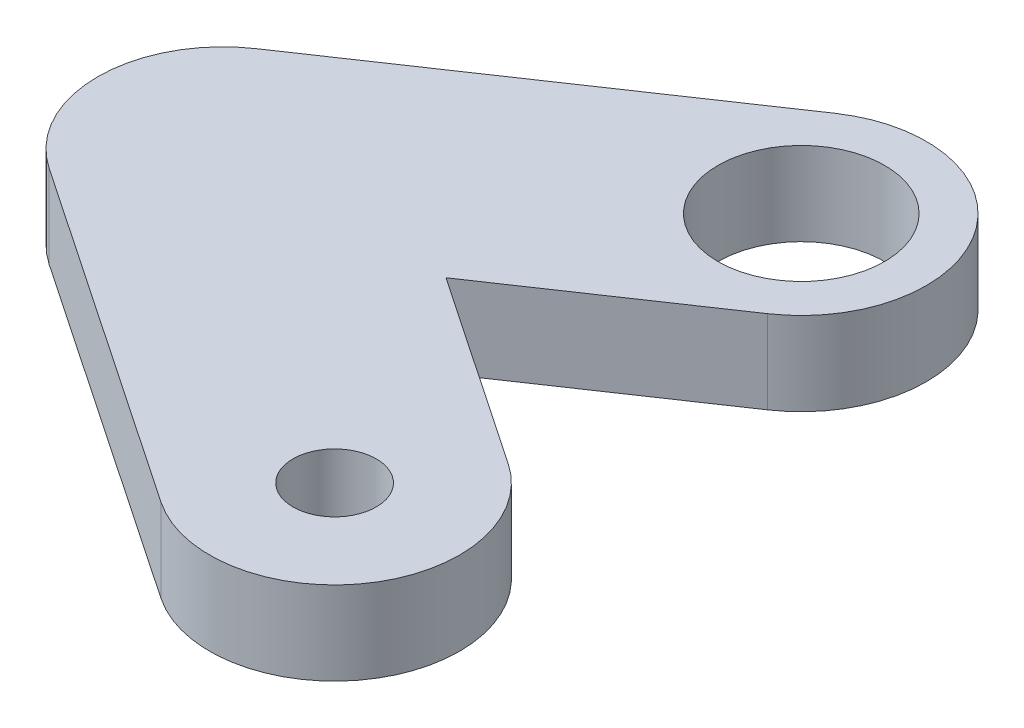
ISO-10303-21;
HEADER;
FILE_DESCRIPTION(('STEP AP214'),'2;1');
FILE_NAME('part.step','',(''),(''),'','','');
FILE_SCHEMA(('AUTOMOTIVE_DESIGN { 1 0 10303 214 1 1 1 1 }'));
ENDSEC;
DATA;
#1=APPLICATION_CONTEXT('core data for automotive mechanical design processes');
#2=APPLICATION_PROTOCOL_DEFINITION('international standard','automotive_design',2000,#1);
#3=PRODUCT_CONTEXT('',#1,'mechanical');
#4=PRODUCT('Part','Part','',(#3));
#5=PRODUCT_RELATED_PRODUCT_CATEGORY('part','',(#4));
#6=PRODUCT_DEFINITION_FORMATION('','',#4);
#7=PRODUCT_DEFINITION_CONTEXT('part definition',#1,'design');
#8=PRODUCT_DEFINITION('design','',#6,#7);
#9=PRODUCT_DEFINITION_SHAPE('','',#8);
#10=(LENGTH_UNIT() NAMED_UNIT(*) SI_UNIT(.MILLI.,.METRE.));
#11=(NAMED_UNIT(*) PLANE_ANGLE_UNIT() SI_UNIT($,.RADIAN.));
#12=(NAMED_UNIT(*) SI_UNIT($,.STERADIAN.) SOLID_ANGLE_UNIT());
#13=UNCERTAINTY_MEASURE_WITH_UNIT(LENGTH_MEASURE(1.E-05),#10,'distance_accuracy_value','');
#14=(GEOMETRIC_REPRESENTATION_CONTEXT(3) GLOBAL_UNCERTAINTY_ASSIGNED_CONTEXT((#13)) GLOBAL_UNIT_ASSIGNED_CONTEXT((#10,
#11,#12)) REPRESENTATION_CONTEXT('',''));
#15=CARTESIAN_POINT('',(0.,0.,0.));
#16=DIRECTION('',(0.,0.,1.));
#17=DIRECTION('',(1.,0.,0.));
#18=AXIS2_PLACEMENT_3D('',#15,#16,#17);
#19=CARTESIAN_POINT('',(0.,10.,56.));
#20=DIRECTION('',(0.,1.,0.));
#21=DIRECTION('',(0.,0.,1.));
#22=AXIS2_PLACEMENT_3D('',#19,#20,#21);
#23=PLANE('',#22);
#24=CARTESIAN_POINT('',(0.,10.,0.));
#25=DIRECTION('',(0.,1.,0.));
#26=DIRECTION('',(0.,0.,1.));
#27=AXIS2_PLACEMENT_3D('',#24,#25,#26);
#28=CIRCLE('',#27,10.);
#29=CARTESIAN_POINT('',(0.,10.,10.));
#30=VERTEX_POINT('',#29);
#31=EDGE_CURVE('E131',#30,#30,#28,.T.);
#32=ORIENTED_EDGE('',*,*,#31,.F.);
#33=EDGE_LOOP('',(#32));
#34=FACE_BOUND('',#33,.T.);
#35=CARTESIAN_POINT('',(0.,10.,56.));
#36=DIRECTION('',(0.,1.,0.));
#37=DIRECTION('',(0.,0.,1.));
#38=AXIS2_PLACEMENT_3D('',#35,#36,#37);
#39=CIRCLE('',#38,15.);
#40=CARTESIAN_POINT('',(-8.4,10.,68.4273891063248));
#41=VERTEX_POINT('',#40);
#42=CARTESIAN_POINT('',(8.4,10.,43.5726108936752));
#43=VERTEX_POINT('',#42);
#44=EDGE_CURVE('E141',#41,#43,#39,.T.);
#45=ORIENTED_EDGE('',*,*,#44,.T.);
#46=DIRECTION('',(-0.828492607088319,0.,-0.56));
#47=VECTOR('',#46,1.);
#48=CARTESIAN_POINT('',(8.4,10.,43.5726108936752));
#49=LINE('',#48,#47);
#50=CARTESIAN_POINT('',(-14.6389160687017,10.,28.));
#51=VERTEX_POINT('',#50);
#52=EDGE_CURVE('E96',#43,#51,#49,.T.);
#53=ORIENTED_EDGE('',*,*,#52,.T.);
#54=DIRECTION('',(0.828492607088319,0.,-0.56));
#55=VECTOR('',#54,1.);
#56=CARTESIAN_POINT('',(8.4,10.,12.4273891063248));
#57=LINE('',#56,#55);
#58=CARTESIAN_POINT('',(8.4,10.,12.4273891063248));
#59=VERTEX_POINT('',#58);
#60=EDGE_CURVE('E154',#51,#59,#57,.T.);
#61=ORIENTED_EDGE('',*,*,#60,.T.);
#62=CARTESIAN_POINT('',(0.,10.,0.));
#63=DIRECTION('',(0.,1.,0.));
#64=DIRECTION('',(0.,0.,1.));
#65=AXIS2_PLACEMENT_3D('',#62,#63,#64);
#66=CIRCLE('',#65,15.);
#67=CARTESIAN_POINT('',(-8.4,10.,-12.4273891063248));
#68=VERTEX_POINT('',#67);
#69=EDGE_CURVE('E115',#59,#68,#66,.T.);
#70=ORIENTED_EDGE('',*,*,#69,.T.);
#71=DIRECTION('',(-0.828492607088319,0.,0.56));
#72=VECTOR('',#71,1.);
#73=CARTESIAN_POINT('',(-8.4,10.,-12.4273891063248));
#74=LINE('',#73,#72);
#75=CARTESIAN_POINT('',(-49.824630354416,10.,15.5726108936752));
#76=VERTEX_POINT('',#75);
#77=EDGE_CURVE('E106',#68,#76,#74,.T.);
#78=ORIENTED_EDGE('',*,*,#77,.T.);
#79=CARTESIAN_POINT('',(-41.424630354416,10.,28.));
#80=DIRECTION('',(0.,1.,0.));
#81=DIRECTION('',(0.,0.,1.));
#82=AXIS2_PLACEMENT_3D('',#79,#80,#81);
#83=CIRCLE('',#82,15.);
#84=CARTESIAN_POINT('',(-49.824630354416,10.,40.4273891063248));
#85=VERTEX_POINT('',#84);
#86=EDGE_CURVE('E109',#76,#85,#83,.T.);
#87=ORIENTED_EDGE('',*,*,#86,.T.);
#88=DIRECTION('',(0.828492607088319,0.,0.56));
#89=VECTOR('',#88,1.);
#90=CARTESIAN_POINT('',(-8.4,10.,68.4273891063248));
#91=LINE('',#90,#89);
#92=EDGE_CURVE('E57',#85,#41,#91,.T.);
#93=ORIENTED_EDGE('',*,*,#92,.T.);
#94=EDGE_LOOP('',(#45,#53,#61,#70,#78,#87,#93));
#95=FACE_BOUND('',#94,.T.);
#96=CARTESIAN_POINT('',(0.,10.,56.));
#97=DIRECTION('',(0.,1.,0.));
#98=DIRECTION('',(0.,0.,1.));
#99=AXIS2_PLACEMENT_3D('',#96,#97,#98);
#100=CIRCLE('',#99,5.);
#101=CARTESIAN_POINT('',(0.,10.,61.));
#102=VERTEX_POINT('',#101);
#103=EDGE_CURVE('E168',#102,#102,#100,.T.);
#104=ORIENTED_EDGE('',*,*,#103,.F.);
#105=EDGE_LOOP('',(#104));
#106=FACE_BOUND('',#105,.T.);
#107=ADVANCED_FACE('F39',(#34,#95,#106),#23,.T.);
#108=CARTESIAN_POINT('',(0.,0.,56.));
#109=DIRECTION('',(0.,1.,0.));
#110=DIRECTION('',(0.,0.,1.));
#111=AXIS2_PLACEMENT_3D('',#108,#109,#110);
#112=PLANE('',#111);
#113=CARTESIAN_POINT('',(0.,0.,56.));
#114=DIRECTION('',(0.,1.,0.));
#115=DIRECTION('',(0.,0.,1.));
#116=AXIS2_PLACEMENT_3D('',#113,#114,#115);
#117=CIRCLE('',#116,15.);
#118=CARTESIAN_POINT('',(-8.4,0.,68.4273891063248));
#119=VERTEX_POINT('',#118);
#120=CARTESIAN_POINT('',(8.4,0.,43.5726108936752));
#121=VERTEX_POINT('',#120);
#122=EDGE_CURVE('E128',#119,#121,#117,.T.);
#123=ORIENTED_EDGE('',*,*,#122,.F.);
#124=DIRECTION('',(0.828492607088319,0.,0.56));
#125=VECTOR('',#124,1.);
#126=CARTESIAN_POINT('',(-8.4,0.,68.4273891063248));
#127=LINE('',#126,#125);
#128=CARTESIAN_POINT('',(-49.824630354416,0.,40.4273891063248));
#129=VERTEX_POINT('',#128);
#130=EDGE_CURVE('E86',#129,#119,#127,.T.);
#131=ORIENTED_EDGE('',*,*,#130,.F.);
#132=CARTESIAN_POINT('',(-41.424630354416,0.,28.));
#133=DIRECTION('',(0.,1.,0.));
#134=DIRECTION('',(0.,0.,1.));
#135=AXIS2_PLACEMENT_3D('',#132,#133,#134);
#136=CIRCLE('',#135,15.);
#137=CARTESIAN_POINT('',(-49.824630354416,0.,15.5726108936752));
#138=VERTEX_POINT('',#137);
#139=EDGE_CURVE('E85',#138,#129,#136,.T.);
#140=ORIENTED_EDGE('',*,*,#139,.F.);
#141=DIRECTION('',(-0.828492607088319,0.,0.56));
#142=VECTOR('',#141,1.);
#143=CARTESIAN_POINT('',(-8.4,0.,-12.4273891063248));
#144=LINE('',#143,#142);
#145=CARTESIAN_POINT('',(-8.4,0.,-12.4273891063248));
#146=VERTEX_POINT('',#145);
#147=EDGE_CURVE('E118',#146,#138,#144,.T.);
#148=ORIENTED_EDGE('',*,*,#147,.F.);
#149=CARTESIAN_POINT('',(0.,0.,0.));
#150=DIRECTION('',(0.,1.,0.));
#151=DIRECTION('',(0.,0.,1.));
#152=AXIS2_PLACEMENT_3D('',#149,#150,#151);
#153=CIRCLE('',#152,15.);
#154=CARTESIAN_POINT('',(8.4,0.,12.4273891063248));
#155=VERTEX_POINT('',#154);
#156=EDGE_CURVE('E137',#155,#146,#153,.T.);
#157=ORIENTED_EDGE('',*,*,#156,.F.);
#158=DIRECTION('',(0.828492607088319,0.,-0.56));
#159=VECTOR('',#158,1.);
#160=CARTESIAN_POINT('',(8.4,0.,12.4273891063248));
#161=LINE('',#160,#159);
#162=CARTESIAN_POINT('',(-14.6389160687017,0.,28.));
#163=VERTEX_POINT('',#162);
#164=EDGE_CURVE('E136',#163,#155,#161,.T.);
#165=ORIENTED_EDGE('',*,*,#164,.F.);
#166=DIRECTION('',(-0.828492607088319,0.,-0.56));
#167=VECTOR('',#166,1.);
#168=CARTESIAN_POINT('',(8.4,0.,43.5726108936752));
#169=LINE('',#168,#167);
#170=EDGE_CURVE('E134',#121,#163,#169,.T.);
#171=ORIENTED_EDGE('',*,*,#170,.F.);
#172=EDGE_LOOP('',(#123,#131,#140,#148,#157,#165,#171));
#173=FACE_BOUND('',#172,.T.);
#174=CARTESIAN_POINT('',(0.,0.,0.));
#175=DIRECTION('',(0.,1.,0.));
#176=DIRECTION('',(0.,0.,1.));
#177=AXIS2_PLACEMENT_3D('',#174,#175,#176);
#178=CIRCLE('',#177,10.);
#179=CARTESIAN_POINT('',(0.,0.,10.));
#180=VERTEX_POINT('',#179);
#181=EDGE_CURVE('E170',#180,#180,#178,.T.);
#182=ORIENTED_EDGE('',*,*,#181,.T.);
#183=EDGE_LOOP('',(#182));
#184=FACE_BOUND('',#183,.T.);
#185=CARTESIAN_POINT('',(0.,0.,56.));
#186=DIRECTION('',(0.,1.,0.));
#187=DIRECTION('',(0.,0.,1.));
#188=AXIS2_PLACEMENT_3D('',#185,#186,#187);
#189=CIRCLE('',#188,5.);
#190=CARTESIAN_POINT('',(0.,0.,61.));
#191=VERTEX_POINT('',#190);
#192=EDGE_CURVE('E174',#191,#191,#189,.T.);
#193=ORIENTED_EDGE('',*,*,#192,.T.);
#194=EDGE_LOOP('',(#193));
#195=FACE_BOUND('',#194,.T.);
#196=ADVANCED_FACE('F157',(#173,#184,#195),#112,.F.);
#197=CARTESIAN_POINT('',(0.,10.,56.));
#198=DIRECTION('',(0.,-1.,0.));
#199=DIRECTION('',(0.,0.,-1.));
#200=AXIS2_PLACEMENT_3D('',#197,#198,#199);
#201=CYLINDRICAL_SURFACE('',#200,15.);
#202=ORIENTED_EDGE('',*,*,#122,.T.);
#203=DIRECTION('',(0.,-1.,0.));
#204=VECTOR('',#203,1.);
#205=CARTESIAN_POINT('',(8.4,10.,43.5726108936752));
#206=LINE('',#205,#204);
#207=EDGE_CURVE('E11',#43,#121,#206,.T.);
#208=ORIENTED_EDGE('',*,*,#207,.F.);
#209=ORIENTED_EDGE('',*,*,#44,.F.);
#210=DIRECTION('',(0.,-1.,0.));
#211=VECTOR('',#210,1.);
#212=CARTESIAN_POINT('',(-8.4,10.,68.4273891063248));
#213=LINE('',#212,#211);
#214=EDGE_CURVE('E127',#41,#119,#213,.T.);
#215=ORIENTED_EDGE('',*,*,#214,.T.);
#216=EDGE_LOOP('',(#202,#208,#209,#215));
#217=FACE_BOUND('',#216,.T.);
#218=ADVANCED_FACE('F41',(#217),#201,.T.);
#219=CARTESIAN_POINT('',(8.4,10.,43.5726108936752));
#220=DIRECTION('',(-0.56,0.,0.828492607088319));
#221=DIRECTION('',(0.828492607088319,0.,0.56));
#222=AXIS2_PLACEMENT_3D('',#219,#220,#221);
#223=PLANE('',#222);
#224=ORIENTED_EDGE('',*,*,#170,.T.);
#225=DIRECTION('',(0.,-1.,0.));
#226=VECTOR('',#225,1.);
#227=CARTESIAN_POINT('',(-14.6389160687017,10.,28.));
#228=LINE('',#227,#226);
#229=EDGE_CURVE('E48',#51,#163,#228,.T.);
#230=ORIENTED_EDGE('',*,*,#229,.F.);
#231=ORIENTED_EDGE('',*,*,#52,.F.);
#232=ORIENTED_EDGE('',*,*,#207,.T.);
#233=EDGE_LOOP('',(#224,#230,#231,#232));
#234=FACE_BOUND('',#233,.T.);
#235=ADVANCED_FACE('F201',(#234),#223,.F.);
#236=CARTESIAN_POINT('',(8.4,10.,12.4273891063248));
#237=DIRECTION('',(-0.56,0.,-0.828492607088319));
#238=DIRECTION('',(-0.828492607088319,0.,0.56));
#239=AXIS2_PLACEMENT_3D('',#236,#237,#238);
#240=PLANE('',#239);
#241=ORIENTED_EDGE('',*,*,#164,.T.);
#242=DIRECTION('',(0.,-1.,0.));
#243=VECTOR('',#242,1.);
#244=CARTESIAN_POINT('',(8.4,10.,12.4273891063248));
#245=LINE('',#244,#243);
#246=EDGE_CURVE('E150',#59,#155,#245,.T.);
#247=ORIENTED_EDGE('',*,*,#246,.F.);
#248=ORIENTED_EDGE('',*,*,#60,.F.);
#249=ORIENTED_EDGE('',*,*,#229,.T.);
#250=EDGE_LOOP('',(#241,#247,#248,#249));
#251=FACE_BOUND('',#250,.T.);
#252=ADVANCED_FACE('F153',(#251),#240,.F.);
#253=CARTESIAN_POINT('',(0.,10.,0.));
#254=DIRECTION('',(0.,-1.,0.));
#255=DIRECTION('',(0.,0.,-1.));
#256=AXIS2_PLACEMENT_3D('',#253,#254,#255);
#257=CYLINDRICAL_SURFACE('',#256,15.);
#258=ORIENTED_EDGE('',*,*,#156,.T.);
#259=DIRECTION('',(0.,-1.,0.));
#260=VECTOR('',#259,1.);
#261=CARTESIAN_POINT('',(-8.4,10.,-12.4273891063248));
#262=LINE('',#261,#260);
#263=EDGE_CURVE('E121',#68,#146,#262,.T.);
#264=ORIENTED_EDGE('',*,*,#263,.F.);
#265=ORIENTED_EDGE('',*,*,#69,.F.);
#266=ORIENTED_EDGE('',*,*,#246,.T.);
#267=EDGE_LOOP('',(#258,#264,#265,#266));
#268=FACE_BOUND('',#267,.T.);
#269=ADVANCED_FACE('F165',(#268),#257,.T.);
#270=CARTESIAN_POINT('',(-8.4,10.,-12.4273891063248));
#271=DIRECTION('',(0.56,0.,0.828492607088319));
#272=DIRECTION('',(0.828492607088319,0.,-0.56));
#273=AXIS2_PLACEMENT_3D('',#270,#271,#272);
#274=PLANE('',#273);
#275=ORIENTED_EDGE('',*,*,#147,.T.);
#276=DIRECTION('',(0.,-1.,0.));
#277=VECTOR('',#276,1.);
#278=CARTESIAN_POINT('',(-49.824630354416,10.,15.5726108936752));
#279=LINE('',#278,#277);
#280=EDGE_CURVE('E120',#76,#138,#279,.T.);
#281=ORIENTED_EDGE('',*,*,#280,.F.);
#282=ORIENTED_EDGE('',*,*,#77,.F.);
#283=ORIENTED_EDGE('',*,*,#263,.T.);
#284=EDGE_LOOP('',(#275,#281,#282,#283));
#285=FACE_BOUND('',#284,.T.);
#286=ADVANCED_FACE('F119',(#285),#274,.F.);
#287=CARTESIAN_POINT('',(-41.424630354416,10.,28.));
#288=DIRECTION('',(0.,-1.,0.));
#289=DIRECTION('',(0.,0.,-1.));
#290=AXIS2_PLACEMENT_3D('',#287,#288,#289);
#291=CYLINDRICAL_SURFACE('',#290,15.);
#292=ORIENTED_EDGE('',*,*,#139,.T.);
#293=DIRECTION('',(0.,-1.,0.));
#294=VECTOR('',#293,1.);
#295=CARTESIAN_POINT('',(-49.824630354416,10.,40.4273891063248));
#296=LINE('',#295,#294);
#297=EDGE_CURVE('E125',#85,#129,#296,.T.);
#298=ORIENTED_EDGE('',*,*,#297,.F.);
#299=ORIENTED_EDGE('',*,*,#86,.F.);
#300=ORIENTED_EDGE('',*,*,#280,.T.);
#301=EDGE_LOOP('',(#292,#298,#299,#300));
#302=FACE_BOUND('',#301,.T.);
#303=ADVANCED_FACE('F123',(#302),#291,.T.);
#304=CARTESIAN_POINT('',(-8.4,10.,68.4273891063248));
#305=DIRECTION('',(0.56,0.,-0.828492607088319));
#306=DIRECTION('',(-0.828492607088319,0.,-0.56));
#307=AXIS2_PLACEMENT_3D('',#304,#305,#306);
#308=PLANE('',#307);
#309=ORIENTED_EDGE('',*,*,#130,.T.);
#310=ORIENTED_EDGE('',*,*,#214,.F.);
#311=ORIENTED_EDGE('',*,*,#92,.F.);
#312=ORIENTED_EDGE('',*,*,#297,.T.);
#313=EDGE_LOOP('',(#309,#310,#311,#312));
#314=FACE_BOUND('',#313,.T.);
#315=ADVANCED_FACE('F192',(#314),#308,.F.);
#316=CARTESIAN_POINT('',(0.,10.,0.));
#317=DIRECTION('',(0.,-1.,0.));
#318=DIRECTION('',(0.,0.,-1.));
#319=AXIS2_PLACEMENT_3D('',#316,#317,#318);
#320=CYLINDRICAL_SURFACE('',#319,10.);
#321=ORIENTED_EDGE('',*,*,#31,.T.);
#322=EDGE_LOOP('',(#321));
#323=FACE_BOUND('',#322,.T.);
#324=ORIENTED_EDGE('',*,*,#181,.F.);
#325=EDGE_LOOP('',(#324));
#326=FACE_BOUND('',#325,.T.);
#327=ADVANCED_FACE('F188',(#323,#326),#320,.F.);
#328=CARTESIAN_POINT('',(0.,10.,56.));
#329=DIRECTION('',(0.,-1.,0.));
#330=DIRECTION('',(0.,0.,-1.));
#331=AXIS2_PLACEMENT_3D('',#328,#329,#330);
#332=CYLINDRICAL_SURFACE('',#331,5.);
#333=ORIENTED_EDGE('',*,*,#103,.T.);
#334=EDGE_LOOP('',(#333));
#335=FACE_BOUND('',#334,.T.);
#336=ORIENTED_EDGE('',*,*,#192,.F.);
#337=EDGE_LOOP('',(#336));
#338=FACE_BOUND('',#337,.T.);
#339=ADVANCED_FACE('F178',(#335,#338),#332,.F.);
#340=CLOSED_SHELL('',(#107,#196,#218,#235,#252,#269,#286,#303,#315,#327,#339));
#341=MANIFOLD_SOLID_BREP('B2',#340);
#342=ADVANCED_BREP_SHAPE_REPRESENTATION('',(#18,#341),#14);
#343=SHAPE_DEFINITION_REPRESENTATION(#9,#342);
ENDSEC;
END-ISO-10303-21;
